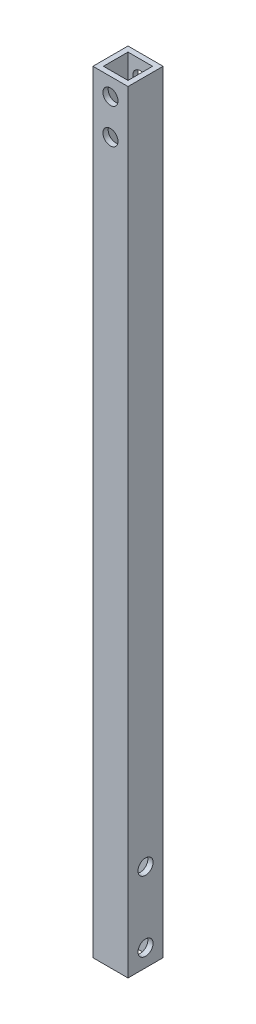
ISO-10303-21;
HEADER;
FILE_DESCRIPTION(('STEP AP214'),'2;1');
FILE_NAME('part.step','',(''),(''),'','','');
FILE_SCHEMA(('AUTOMOTIVE_DESIGN { 1 0 10303 214 1 1 1 1 }'));
ENDSEC;
DATA;
#1=APPLICATION_CONTEXT('core data for automotive mechanical design processes');
#2=APPLICATION_PROTOCOL_DEFINITION('international standard','automotive_design',2000,#1);
#3=PRODUCT_CONTEXT('',#1,'mechanical');
#4=PRODUCT('Part','Part','',(#3));
#5=PRODUCT_RELATED_PRODUCT_CATEGORY('part','',(#4));
#6=PRODUCT_DEFINITION_FORMATION('','',#4);
#7=PRODUCT_DEFINITION_CONTEXT('part definition',#1,'design');
#8=PRODUCT_DEFINITION('design','',#6,#7);
#9=PRODUCT_DEFINITION_SHAPE('','',#8);
#10=(LENGTH_UNIT() NAMED_UNIT(*) SI_UNIT(.MILLI.,.METRE.));
#11=(NAMED_UNIT(*) PLANE_ANGLE_UNIT() SI_UNIT($,.RADIAN.));
#12=(NAMED_UNIT(*) SI_UNIT($,.STERADIAN.) SOLID_ANGLE_UNIT());
#13=UNCERTAINTY_MEASURE_WITH_UNIT(LENGTH_MEASURE(1.E-05),#10,'distance_accuracy_value','');
#14=(GEOMETRIC_REPRESENTATION_CONTEXT(3) GLOBAL_UNCERTAINTY_ASSIGNED_CONTEXT((#13)) GLOBAL_UNIT_ASSIGNED_CONTEXT((#10,
#11,#12)) REPRESENTATION_CONTEXT('',''));
#15=CARTESIAN_POINT('',(0.,0.,0.));
#16=DIRECTION('',(0.,0.,1.));
#17=DIRECTION('',(1.,0.,0.));
#18=AXIS2_PLACEMENT_3D('',#15,#16,#17);
#19=CARTESIAN_POINT('',(0.,220.,0.));
#20=DIRECTION('',(0.,1.,0.));
#21=DIRECTION('',(0.,0.,1.));
#22=AXIS2_PLACEMENT_3D('',#19,#20,#21);
#23=PLANE('',#22);
#24=DIRECTION('',(0.,0.,-1.));
#25=VECTOR('',#24,1.);
#26=CARTESIAN_POINT('',(5.,220.,-5.));
#27=LINE('',#26,#25);
#28=CARTESIAN_POINT('',(5.,220.,5.));
#29=VERTEX_POINT('',#28);
#30=CARTESIAN_POINT('',(5.,220.,-5.));
#31=VERTEX_POINT('',#30);
#32=EDGE_CURVE('E164',#29,#31,#27,.T.);
#33=ORIENTED_EDGE('',*,*,#32,.T.);
#34=DIRECTION('',(-1.,0.,0.));
#35=VECTOR('',#34,1.);
#36=CARTESIAN_POINT('',(-5.,220.,-5.));
#37=LINE('',#36,#35);
#38=CARTESIAN_POINT('',(-5.,220.,-5.));
#39=VERTEX_POINT('',#38);
#40=EDGE_CURVE('E167',#31,#39,#37,.T.);
#41=ORIENTED_EDGE('',*,*,#40,.T.);
#42=DIRECTION('',(0.,0.,1.));
#43=VECTOR('',#42,1.);
#44=CARTESIAN_POINT('',(-5.,220.,-5.));
#45=LINE('',#44,#43);
#46=CARTESIAN_POINT('',(-5.,220.,5.));
#47=VERTEX_POINT('',#46);
#48=EDGE_CURVE('E170',#39,#47,#45,.T.);
#49=ORIENTED_EDGE('',*,*,#48,.T.);
#50=DIRECTION('',(1.,0.,0.));
#51=VECTOR('',#50,1.);
#52=CARTESIAN_POINT('',(-5.,220.,5.));
#53=LINE('',#52,#51);
#54=EDGE_CURVE('E172',#47,#29,#53,.T.);
#55=ORIENTED_EDGE('',*,*,#54,.T.);
#56=EDGE_LOOP('',(#33,#41,#49,#55));
#57=FACE_BOUND('',#56,.T.);
#58=DIRECTION('',(-1.,0.,0.));
#59=VECTOR('',#58,1.);
#60=CARTESIAN_POINT('',(-5.,220.,-3.5));
#61=LINE('',#60,#59);
#62=CARTESIAN_POINT('',(3.5,220.,-3.5));
#63=VERTEX_POINT('',#62);
#64=CARTESIAN_POINT('',(-3.5,220.,-3.5));
#65=VERTEX_POINT('',#64);
#66=EDGE_CURVE('E134',#63,#65,#61,.T.);
#67=ORIENTED_EDGE('',*,*,#66,.F.);
#68=DIRECTION('',(0.,0.,-1.));
#69=VECTOR('',#68,1.);
#70=CARTESIAN_POINT('',(3.5,220.,-5.));
#71=LINE('',#70,#69);
#72=CARTESIAN_POINT('',(3.5,220.,3.5));
#73=VERTEX_POINT('',#72);
#74=EDGE_CURVE('E126',#73,#63,#71,.T.);
#75=ORIENTED_EDGE('',*,*,#74,.F.);
#76=DIRECTION('',(1.,0.,0.));
#77=VECTOR('',#76,1.);
#78=CARTESIAN_POINT('',(-5.,220.,3.5));
#79=LINE('',#78,#77);
#80=CARTESIAN_POINT('',(-3.5,220.,3.5));
#81=VERTEX_POINT('',#80);
#82=EDGE_CURVE('E148',#81,#73,#79,.T.);
#83=ORIENTED_EDGE('',*,*,#82,.F.);
#84=DIRECTION('',(0.,0.,1.));
#85=VECTOR('',#84,1.);
#86=CARTESIAN_POINT('',(-3.5,220.,-5.));
#87=LINE('',#86,#85);
#88=EDGE_CURVE('E146',#65,#81,#87,.T.);
#89=ORIENTED_EDGE('',*,*,#88,.F.);
#90=EDGE_LOOP('',(#67,#75,#83,#89));
#91=FACE_BOUND('',#90,.T.);
#92=ADVANCED_FACE('F59',(#57,#91),#23,.T.);
#93=CARTESIAN_POINT('',(0.,0.,0.));
#94=DIRECTION('',(0.,1.,0.));
#95=DIRECTION('',(0.,0.,1.));
#96=AXIS2_PLACEMENT_3D('',#93,#94,#95);
#97=PLANE('',#96);
#98=DIRECTION('',(0.,0.,-1.));
#99=VECTOR('',#98,1.);
#100=CARTESIAN_POINT('',(5.,0.,-5.));
#101=LINE('',#100,#99);
#102=CARTESIAN_POINT('',(5.,0.,5.));
#103=VERTEX_POINT('',#102);
#104=CARTESIAN_POINT('',(5.,0.,-5.));
#105=VERTEX_POINT('',#104);
#106=EDGE_CURVE('E142',#103,#105,#101,.T.);
#107=ORIENTED_EDGE('',*,*,#106,.F.);
#108=DIRECTION('',(1.,0.,0.));
#109=VECTOR('',#108,1.);
#110=CARTESIAN_POINT('',(-5.,0.,5.));
#111=LINE('',#110,#109);
#112=CARTESIAN_POINT('',(-5.,0.,5.));
#113=VERTEX_POINT('',#112);
#114=EDGE_CURVE('E168',#113,#103,#111,.T.);
#115=ORIENTED_EDGE('',*,*,#114,.F.);
#116=DIRECTION('',(0.,0.,1.));
#117=VECTOR('',#116,1.);
#118=CARTESIAN_POINT('',(-5.,0.,-5.));
#119=LINE('',#118,#117);
#120=CARTESIAN_POINT('',(-5.,0.,-5.));
#121=VERTEX_POINT('',#120);
#122=EDGE_CURVE('E179',#121,#113,#119,.T.);
#123=ORIENTED_EDGE('',*,*,#122,.F.);
#124=DIRECTION('',(-1.,0.,0.));
#125=VECTOR('',#124,1.);
#126=CARTESIAN_POINT('',(-5.,0.,-5.));
#127=LINE('',#126,#125);
#128=EDGE_CURVE('E177',#105,#121,#127,.T.);
#129=ORIENTED_EDGE('',*,*,#128,.F.);
#130=EDGE_LOOP('',(#107,#115,#123,#129));
#131=FACE_BOUND('',#130,.T.);
#132=DIRECTION('',(0.,0.,-1.));
#133=VECTOR('',#132,1.);
#134=CARTESIAN_POINT('',(3.5,0.,-5.));
#135=LINE('',#134,#133);
#136=CARTESIAN_POINT('',(3.5,0.,3.5));
#137=VERTEX_POINT('',#136);
#138=CARTESIAN_POINT('',(3.5,0.,-3.5));
#139=VERTEX_POINT('',#138);
#140=EDGE_CURVE('E84',#137,#139,#135,.T.);
#141=ORIENTED_EDGE('',*,*,#140,.T.);
#142=DIRECTION('',(-1.,0.,0.));
#143=VECTOR('',#142,1.);
#144=CARTESIAN_POINT('',(-5.,0.,-3.5));
#145=LINE('',#144,#143);
#146=CARTESIAN_POINT('',(-3.5,0.,-3.5));
#147=VERTEX_POINT('',#146);
#148=EDGE_CURVE('E141',#139,#147,#145,.T.);
#149=ORIENTED_EDGE('',*,*,#148,.T.);
#150=DIRECTION('',(0.,0.,1.));
#151=VECTOR('',#150,1.);
#152=CARTESIAN_POINT('',(-3.5,0.,-5.));
#153=LINE('',#152,#151);
#154=CARTESIAN_POINT('',(-3.5,0.,3.5));
#155=VERTEX_POINT('',#154);
#156=EDGE_CURVE('E156',#147,#155,#153,.T.);
#157=ORIENTED_EDGE('',*,*,#156,.T.);
#158=DIRECTION('',(1.,0.,0.));
#159=VECTOR('',#158,1.);
#160=CARTESIAN_POINT('',(-5.,0.,3.5));
#161=LINE('',#160,#159);
#162=EDGE_CURVE('E135',#155,#137,#161,.T.);
#163=ORIENTED_EDGE('',*,*,#162,.T.);
#164=EDGE_LOOP('',(#141,#149,#157,#163));
#165=FACE_BOUND('',#164,.T.);
#166=ADVANCED_FACE('F267',(#131,#165),#97,.F.);
#167=CARTESIAN_POINT('',(5.,220.,-5.));
#168=DIRECTION('',(-1.,0.,0.));
#169=DIRECTION('',(0.,0.,1.));
#170=AXIS2_PLACEMENT_3D('',#167,#168,#169);
#171=PLANE('',#170);
#172=CARTESIAN_POINT('',(5.,5.,0.));
#173=DIRECTION('',(1.,0.,0.));
#174=DIRECTION('',(0.,0.,-1.));
#175=AXIS2_PLACEMENT_3D('',#172,#173,#174);
#176=CIRCLE('',#175,2.15);
#177=CARTESIAN_POINT('',(5.,5.,-2.15));
#178=VERTEX_POINT('',#177);
#179=EDGE_CURVE('E205',#178,#178,#176,.T.);
#180=ORIENTED_EDGE('',*,*,#179,.F.);
#181=EDGE_LOOP('',(#180));
#182=FACE_BOUND('',#181,.T.);
#183=CARTESIAN_POINT('',(5.,25.,0.));
#184=DIRECTION('',(1.,0.,0.));
#185=DIRECTION('',(0.,0.,-1.));
#186=AXIS2_PLACEMENT_3D('',#183,#184,#185);
#187=CIRCLE('',#186,2.15);
#188=CARTESIAN_POINT('',(5.,25.,-2.15));
#189=VERTEX_POINT('',#188);
#190=EDGE_CURVE('E215',#189,#189,#187,.T.);
#191=ORIENTED_EDGE('',*,*,#190,.F.);
#192=EDGE_LOOP('',(#191));
#193=FACE_BOUND('',#192,.T.);
#194=ORIENTED_EDGE('',*,*,#106,.T.);
#195=DIRECTION('',(0.,-1.,0.));
#196=VECTOR('',#195,1.);
#197=CARTESIAN_POINT('',(5.,220.,-5.));
#198=LINE('',#197,#196);
#199=EDGE_CURVE('E12',#31,#105,#198,.T.);
#200=ORIENTED_EDGE('',*,*,#199,.F.);
#201=ORIENTED_EDGE('',*,*,#32,.F.);
#202=DIRECTION('',(0.,-1.,0.));
#203=VECTOR('',#202,1.);
#204=CARTESIAN_POINT('',(5.,220.,5.));
#205=LINE('',#204,#203);
#206=EDGE_CURVE('E174',#29,#103,#205,.T.);
#207=ORIENTED_EDGE('',*,*,#206,.T.);
#208=EDGE_LOOP('',(#194,#200,#201,#207));
#209=FACE_BOUND('',#208,.T.);
#210=ADVANCED_FACE('F61',(#182,#193,#209),#171,.F.);
#211=CARTESIAN_POINT('',(-5.,220.,-5.));
#212=DIRECTION('',(0.,0.,1.));
#213=DIRECTION('',(1.,0.,0.));
#214=AXIS2_PLACEMENT_3D('',#211,#212,#213);
#215=PLANE('',#214);
#216=CARTESIAN_POINT('',(0.,205.,-5.));
#217=DIRECTION('',(0.,0.,1.));
#218=DIRECTION('',(1.,0.,0.));
#219=AXIS2_PLACEMENT_3D('',#216,#217,#218);
#220=CIRCLE('',#219,2.15000000000004);
#221=CARTESIAN_POINT('',(2.15000000000004,205.,-5.));
#222=VERTEX_POINT('',#221);
#223=EDGE_CURVE('E193',#222,#222,#220,.T.);
#224=ORIENTED_EDGE('',*,*,#223,.T.);
#225=EDGE_LOOP('',(#224));
#226=FACE_BOUND('',#225,.T.);
#227=CARTESIAN_POINT('',(0.,215.,-5.));
#228=DIRECTION('',(0.,0.,1.));
#229=DIRECTION('',(1.,0.,0.));
#230=AXIS2_PLACEMENT_3D('',#227,#228,#229);
#231=CIRCLE('',#230,2.15000000000004);
#232=CARTESIAN_POINT('',(2.15000000000004,215.,-5.));
#233=VERTEX_POINT('',#232);
#234=EDGE_CURVE('E227',#233,#233,#231,.T.);
#235=ORIENTED_EDGE('',*,*,#234,.T.);
#236=EDGE_LOOP('',(#235));
#237=FACE_BOUND('',#236,.T.);
#238=ORIENTED_EDGE('',*,*,#128,.T.);
#239=DIRECTION('',(0.,-1.,0.));
#240=VECTOR('',#239,1.);
#241=CARTESIAN_POINT('',(-5.,220.,-5.));
#242=LINE('',#241,#240);
#243=EDGE_CURVE('E68',#39,#121,#242,.T.);
#244=ORIENTED_EDGE('',*,*,#243,.F.);
#245=ORIENTED_EDGE('',*,*,#40,.F.);
#246=ORIENTED_EDGE('',*,*,#199,.T.);
#247=EDGE_LOOP('',(#238,#244,#245,#246));
#248=FACE_BOUND('',#247,.T.);
#249=ADVANCED_FACE('F253',(#226,#237,#248),#215,.F.);
#250=CARTESIAN_POINT('',(-5.,220.,-5.));
#251=DIRECTION('',(1.,0.,0.));
#252=DIRECTION('',(0.,0.,-1.));
#253=AXIS2_PLACEMENT_3D('',#250,#251,#252);
#254=PLANE('',#253);
#255=CARTESIAN_POINT('',(-5.,5.,0.));
#256=DIRECTION('',(1.,0.,0.));
#257=DIRECTION('',(0.,0.,-1.));
#258=AXIS2_PLACEMENT_3D('',#255,#256,#257);
#259=CIRCLE('',#258,2.15);
#260=CARTESIAN_POINT('',(-5.,5.,-2.15));
#261=VERTEX_POINT('',#260);
#262=EDGE_CURVE('E199',#261,#261,#259,.T.);
#263=ORIENTED_EDGE('',*,*,#262,.T.);
#264=EDGE_LOOP('',(#263));
#265=FACE_BOUND('',#264,.T.);
#266=CARTESIAN_POINT('',(-5.,25.,0.));
#267=DIRECTION('',(1.,0.,0.));
#268=DIRECTION('',(0.,0.,-1.));
#269=AXIS2_PLACEMENT_3D('',#266,#267,#268);
#270=CIRCLE('',#269,2.15);
#271=CARTESIAN_POINT('',(-5.,25.,-2.15));
#272=VERTEX_POINT('',#271);
#273=EDGE_CURVE('E210',#272,#272,#270,.T.);
#274=ORIENTED_EDGE('',*,*,#273,.T.);
#275=EDGE_LOOP('',(#274));
#276=FACE_BOUND('',#275,.T.);
#277=ORIENTED_EDGE('',*,*,#122,.T.);
#278=DIRECTION('',(0.,-1.,0.));
#279=VECTOR('',#278,1.);
#280=CARTESIAN_POINT('',(-5.,220.,5.));
#281=LINE('',#280,#279);
#282=EDGE_CURVE('E184',#47,#113,#281,.T.);
#283=ORIENTED_EDGE('',*,*,#282,.F.);
#284=ORIENTED_EDGE('',*,*,#48,.F.);
#285=ORIENTED_EDGE('',*,*,#243,.T.);
#286=EDGE_LOOP('',(#277,#283,#284,#285));
#287=FACE_BOUND('',#286,.T.);
#288=ADVANCED_FACE('F256',(#265,#276,#287),#254,.F.);
#289=CARTESIAN_POINT('',(-5.,220.,5.));
#290=DIRECTION('',(0.,0.,-1.));
#291=DIRECTION('',(-1.,0.,0.));
#292=AXIS2_PLACEMENT_3D('',#289,#290,#291);
#293=PLANE('',#292);
#294=CARTESIAN_POINT('',(0.,205.,5.));
#295=DIRECTION('',(0.,0.,1.));
#296=DIRECTION('',(1.,0.,0.));
#297=AXIS2_PLACEMENT_3D('',#294,#295,#296);
#298=CIRCLE('',#297,2.15000000000004);
#299=CARTESIAN_POINT('',(2.15000000000004,205.,5.));
#300=VERTEX_POINT('',#299);
#301=EDGE_CURVE('E224',#300,#300,#298,.T.);
#302=ORIENTED_EDGE('',*,*,#301,.F.);
#303=EDGE_LOOP('',(#302));
#304=FACE_BOUND('',#303,.T.);
#305=CARTESIAN_POINT('',(0.,215.,5.));
#306=DIRECTION('',(0.,0.,1.));
#307=DIRECTION('',(1.,0.,0.));
#308=AXIS2_PLACEMENT_3D('',#305,#306,#307);
#309=CIRCLE('',#308,2.15000000000004);
#310=CARTESIAN_POINT('',(2.15000000000004,215.,5.));
#311=VERTEX_POINT('',#310);
#312=EDGE_CURVE('E221',#311,#311,#309,.T.);
#313=ORIENTED_EDGE('',*,*,#312,.F.);
#314=EDGE_LOOP('',(#313));
#315=FACE_BOUND('',#314,.T.);
#316=ORIENTED_EDGE('',*,*,#114,.T.);
#317=ORIENTED_EDGE('',*,*,#206,.F.);
#318=ORIENTED_EDGE('',*,*,#54,.F.);
#319=ORIENTED_EDGE('',*,*,#282,.T.);
#320=EDGE_LOOP('',(#316,#317,#318,#319));
#321=FACE_BOUND('',#320,.T.);
#322=ADVANCED_FACE('F271',(#304,#315,#321),#293,.F.);
#323=CARTESIAN_POINT('',(3.5,220.,-5.));
#324=DIRECTION('',(-1.,0.,0.));
#325=DIRECTION('',(0.,0.,1.));
#326=AXIS2_PLACEMENT_3D('',#323,#324,#325);
#327=PLANE('',#326);
#328=CARTESIAN_POINT('',(3.5,5.,0.));
#329=DIRECTION('',(-1.,0.,0.));
#330=DIRECTION('',(0.,0.,1.));
#331=AXIS2_PLACEMENT_3D('',#328,#329,#330);
#332=CIRCLE('',#331,2.15);
#333=CARTESIAN_POINT('',(3.5,5.,2.15));
#334=VERTEX_POINT('',#333);
#335=EDGE_CURVE('E218',#334,#334,#332,.T.);
#336=ORIENTED_EDGE('',*,*,#335,.F.);
#337=EDGE_LOOP('',(#336));
#338=FACE_BOUND('',#337,.T.);
#339=CARTESIAN_POINT('',(3.5,25.,0.));
#340=DIRECTION('',(-1.,0.,0.));
#341=DIRECTION('',(0.,0.,1.));
#342=AXIS2_PLACEMENT_3D('',#339,#340,#341);
#343=CIRCLE('',#342,2.15);
#344=CARTESIAN_POINT('',(3.5,25.,2.15));
#345=VERTEX_POINT('',#344);
#346=EDGE_CURVE('E198',#345,#345,#343,.T.);
#347=ORIENTED_EDGE('',*,*,#346,.F.);
#348=EDGE_LOOP('',(#347));
#349=FACE_BOUND('',#348,.T.);
#350=ORIENTED_EDGE('',*,*,#140,.F.);
#351=DIRECTION('',(0.,-1.,0.));
#352=VECTOR('',#351,1.);
#353=CARTESIAN_POINT('',(3.5,220.,3.5));
#354=LINE('',#353,#352);
#355=EDGE_CURVE('E130',#73,#137,#354,.T.);
#356=ORIENTED_EDGE('',*,*,#355,.F.);
#357=ORIENTED_EDGE('',*,*,#74,.T.);
#358=DIRECTION('',(0.,-1.,0.));
#359=VECTOR('',#358,1.);
#360=CARTESIAN_POINT('',(3.5,220.,-3.5));
#361=LINE('',#360,#359);
#362=EDGE_CURVE('E129',#63,#139,#361,.T.);
#363=ORIENTED_EDGE('',*,*,#362,.T.);
#364=EDGE_LOOP('',(#350,#356,#357,#363));
#365=FACE_BOUND('',#364,.T.);
#366=ADVANCED_FACE('F128',(#338,#349,#365),#327,.T.);
#367=CARTESIAN_POINT('',(-5.,220.,-3.5));
#368=DIRECTION('',(0.,0.,1.));
#369=DIRECTION('',(1.,0.,0.));
#370=AXIS2_PLACEMENT_3D('',#367,#368,#369);
#371=PLANE('',#370);
#372=CARTESIAN_POINT('',(0.,205.,-3.5));
#373=DIRECTION('',(0.,0.,1.));
#374=DIRECTION('',(1.,0.,0.));
#375=AXIS2_PLACEMENT_3D('',#372,#373,#374);
#376=CIRCLE('',#375,2.15000000000004);
#377=CARTESIAN_POINT('',(2.15000000000004,205.,-3.5));
#378=VERTEX_POINT('',#377);
#379=EDGE_CURVE('E154',#378,#378,#376,.T.);
#380=ORIENTED_EDGE('',*,*,#379,.F.);
#381=EDGE_LOOP('',(#380));
#382=FACE_BOUND('',#381,.T.);
#383=CARTESIAN_POINT('',(0.,215.,-3.5));
#384=DIRECTION('',(0.,0.,1.));
#385=DIRECTION('',(1.,0.,0.));
#386=AXIS2_PLACEMENT_3D('',#383,#384,#385);
#387=CIRCLE('',#386,2.15000000000004);
#388=CARTESIAN_POINT('',(2.15000000000004,215.,-3.5));
#389=VERTEX_POINT('',#388);
#390=EDGE_CURVE('E192',#389,#389,#387,.T.);
#391=ORIENTED_EDGE('',*,*,#390,.F.);
#392=EDGE_LOOP('',(#391));
#393=FACE_BOUND('',#392,.T.);
#394=ORIENTED_EDGE('',*,*,#148,.F.);
#395=ORIENTED_EDGE('',*,*,#362,.F.);
#396=ORIENTED_EDGE('',*,*,#66,.T.);
#397=DIRECTION('',(0.,-1.,0.));
#398=VECTOR('',#397,1.);
#399=CARTESIAN_POINT('',(-3.5,220.,-3.5));
#400=LINE('',#399,#398);
#401=EDGE_CURVE('E143',#65,#147,#400,.T.);
#402=ORIENTED_EDGE('',*,*,#401,.T.);
#403=EDGE_LOOP('',(#394,#395,#396,#402));
#404=FACE_BOUND('',#403,.T.);
#405=ADVANCED_FACE('F138',(#382,#393,#404),#371,.T.);
#406=CARTESIAN_POINT('',(-3.5,220.,-5.));
#407=DIRECTION('',(1.,0.,0.));
#408=DIRECTION('',(0.,0.,-1.));
#409=AXIS2_PLACEMENT_3D('',#406,#407,#408);
#410=PLANE('',#409);
#411=CARTESIAN_POINT('',(-3.5,5.,0.));
#412=DIRECTION('',(1.,0.,0.));
#413=DIRECTION('',(0.,0.,-1.));
#414=AXIS2_PLACEMENT_3D('',#411,#412,#413);
#415=CIRCLE('',#414,2.15);
#416=CARTESIAN_POINT('',(-3.5,5.,-2.15));
#417=VERTEX_POINT('',#416);
#418=EDGE_CURVE('E63',#417,#417,#415,.T.);
#419=ORIENTED_EDGE('',*,*,#418,.F.);
#420=EDGE_LOOP('',(#419));
#421=FACE_BOUND('',#420,.T.);
#422=CARTESIAN_POINT('',(-3.5,25.,0.));
#423=DIRECTION('',(1.,0.,0.));
#424=DIRECTION('',(0.,0.,-1.));
#425=AXIS2_PLACEMENT_3D('',#422,#423,#424);
#426=CIRCLE('',#425,2.15);
#427=CARTESIAN_POINT('',(-3.5,25.,-2.15));
#428=VERTEX_POINT('',#427);
#429=EDGE_CURVE('E196',#428,#428,#426,.T.);
#430=ORIENTED_EDGE('',*,*,#429,.F.);
#431=EDGE_LOOP('',(#430));
#432=FACE_BOUND('',#431,.T.);
#433=ORIENTED_EDGE('',*,*,#156,.F.);
#434=ORIENTED_EDGE('',*,*,#401,.F.);
#435=ORIENTED_EDGE('',*,*,#88,.T.);
#436=DIRECTION('',(0.,-1.,0.));
#437=VECTOR('',#436,1.);
#438=CARTESIAN_POINT('',(-3.5,220.,3.5));
#439=LINE('',#438,#437);
#440=EDGE_CURVE('E76',#81,#155,#439,.T.);
#441=ORIENTED_EDGE('',*,*,#440,.T.);
#442=EDGE_LOOP('',(#433,#434,#435,#441));
#443=FACE_BOUND('',#442,.T.);
#444=ADVANCED_FACE('F241',(#421,#432,#443),#410,.T.);
#445=CARTESIAN_POINT('',(-5.,220.,3.5));
#446=DIRECTION('',(0.,0.,-1.));
#447=DIRECTION('',(-1.,0.,0.));
#448=AXIS2_PLACEMENT_3D('',#445,#446,#447);
#449=PLANE('',#448);
#450=CARTESIAN_POINT('',(0.,205.,3.5));
#451=DIRECTION('',(0.,0.,-1.));
#452=DIRECTION('',(-1.,0.,0.));
#453=AXIS2_PLACEMENT_3D('',#450,#451,#452);
#454=CIRCLE('',#453,2.15000000000004);
#455=CARTESIAN_POINT('',(-2.15000000000003,205.,3.5));
#456=VERTEX_POINT('',#455);
#457=EDGE_CURVE('E194',#456,#456,#454,.T.);
#458=ORIENTED_EDGE('',*,*,#457,.F.);
#459=EDGE_LOOP('',(#458));
#460=FACE_BOUND('',#459,.T.);
#461=CARTESIAN_POINT('',(0.,215.,3.5));
#462=DIRECTION('',(0.,0.,-1.));
#463=DIRECTION('',(-1.,0.,0.));
#464=AXIS2_PLACEMENT_3D('',#461,#462,#463);
#465=CIRCLE('',#464,2.15000000000004);
#466=CARTESIAN_POINT('',(-2.15000000000003,215.,3.5));
#467=VERTEX_POINT('',#466);
#468=EDGE_CURVE('E189',#467,#467,#465,.T.);
#469=ORIENTED_EDGE('',*,*,#468,.F.);
#470=EDGE_LOOP('',(#469));
#471=FACE_BOUND('',#470,.T.);
#472=ORIENTED_EDGE('',*,*,#162,.F.);
#473=ORIENTED_EDGE('',*,*,#440,.F.);
#474=ORIENTED_EDGE('',*,*,#82,.T.);
#475=ORIENTED_EDGE('',*,*,#355,.T.);
#476=EDGE_LOOP('',(#472,#473,#474,#475));
#477=FACE_BOUND('',#476,.T.);
#478=ADVANCED_FACE('F353',(#460,#471,#477),#449,.T.);
#479=CARTESIAN_POINT('',(0.,215.,-5.));
#480=DIRECTION('',(0.,0.,1.));
#481=DIRECTION('',(1.,0.,0.));
#482=AXIS2_PLACEMENT_3D('',#479,#480,#481);
#483=CYLINDRICAL_SURFACE('',#482,2.15000000000004);
#484=ORIENTED_EDGE('',*,*,#468,.T.);
#485=EDGE_LOOP('',(#484));
#486=FACE_BOUND('',#485,.T.);
#487=ORIENTED_EDGE('',*,*,#312,.T.);
#488=EDGE_LOOP('',(#487));
#489=FACE_BOUND('',#488,.T.);
#490=ADVANCED_FACE('F250',(#486,#489),#483,.F.);
#491=CARTESIAN_POINT('',(0.,205.,-5.));
#492=DIRECTION('',(0.,0.,1.));
#493=DIRECTION('',(1.,0.,0.));
#494=AXIS2_PLACEMENT_3D('',#491,#492,#493);
#495=CYLINDRICAL_SURFACE('',#494,2.15000000000004);
#496=ORIENTED_EDGE('',*,*,#457,.T.);
#497=EDGE_LOOP('',(#496));
#498=FACE_BOUND('',#497,.T.);
#499=ORIENTED_EDGE('',*,*,#301,.T.);
#500=EDGE_LOOP('',(#499));
#501=FACE_BOUND('',#500,.T.);
#502=ADVANCED_FACE('F248',(#498,#501),#495,.F.);
#503=ORIENTED_EDGE('',*,*,#390,.T.);
#504=EDGE_LOOP('',(#503));
#505=FACE_BOUND('',#504,.T.);
#506=ORIENTED_EDGE('',*,*,#234,.F.);
#507=EDGE_LOOP('',(#506));
#508=FACE_BOUND('',#507,.T.);
#509=ADVANCED_FACE('F245',(#505,#508),#483,.F.);
#510=ORIENTED_EDGE('',*,*,#379,.T.);
#511=EDGE_LOOP('',(#510));
#512=FACE_BOUND('',#511,.T.);
#513=ORIENTED_EDGE('',*,*,#223,.F.);
#514=EDGE_LOOP('',(#513));
#515=FACE_BOUND('',#514,.T.);
#516=ADVANCED_FACE('F236',(#512,#515),#495,.F.);
#517=CARTESIAN_POINT('',(-5.,25.,0.));
#518=DIRECTION('',(1.,0.,0.));
#519=DIRECTION('',(0.,0.,-1.));
#520=AXIS2_PLACEMENT_3D('',#517,#518,#519);
#521=CYLINDRICAL_SURFACE('',#520,2.15);
#522=ORIENTED_EDGE('',*,*,#429,.T.);
#523=EDGE_LOOP('',(#522));
#524=FACE_BOUND('',#523,.T.);
#525=ORIENTED_EDGE('',*,*,#273,.F.);
#526=EDGE_LOOP('',(#525));
#527=FACE_BOUND('',#526,.T.);
#528=ADVANCED_FACE('F293',(#524,#527),#521,.F.);
#529=CARTESIAN_POINT('',(-5.,5.,0.));
#530=DIRECTION('',(1.,0.,0.));
#531=DIRECTION('',(0.,0.,-1.));
#532=AXIS2_PLACEMENT_3D('',#529,#530,#531);
#533=CYLINDRICAL_SURFACE('',#532,2.15);
#534=ORIENTED_EDGE('',*,*,#418,.T.);
#535=EDGE_LOOP('',(#534));
#536=FACE_BOUND('',#535,.T.);
#537=ORIENTED_EDGE('',*,*,#262,.F.);
#538=EDGE_LOOP('',(#537));
#539=FACE_BOUND('',#538,.T.);
#540=ADVANCED_FACE('F295',(#536,#539),#533,.F.);
#541=ORIENTED_EDGE('',*,*,#346,.T.);
#542=EDGE_LOOP('',(#541));
#543=FACE_BOUND('',#542,.T.);
#544=ORIENTED_EDGE('',*,*,#190,.T.);
#545=EDGE_LOOP('',(#544));
#546=FACE_BOUND('',#545,.T.);
#547=ADVANCED_FACE('F297',(#543,#546),#521,.F.);
#548=ORIENTED_EDGE('',*,*,#335,.T.);
#549=EDGE_LOOP('',(#548));
#550=FACE_BOUND('',#549,.T.);
#551=ORIENTED_EDGE('',*,*,#179,.T.);
#552=EDGE_LOOP('',(#551));
#553=FACE_BOUND('',#552,.T.);
#554=ADVANCED_FACE('F304',(#550,#553),#533,.F.);
#555=CLOSED_SHELL('',(#92,#166,#210,#249,#288,#322,#366,#405,#444,#478,#490,#502,#509,#516,#528,
#540,#547,#554));
#556=MANIFOLD_SOLID_BREP('B2',#555);
#557=ADVANCED_BREP_SHAPE_REPRESENTATION('',(#18,#556),#14);
#558=SHAPE_DEFINITION_REPRESENTATION(#9,#557);
ENDSEC;
END-ISO-10303-21;
